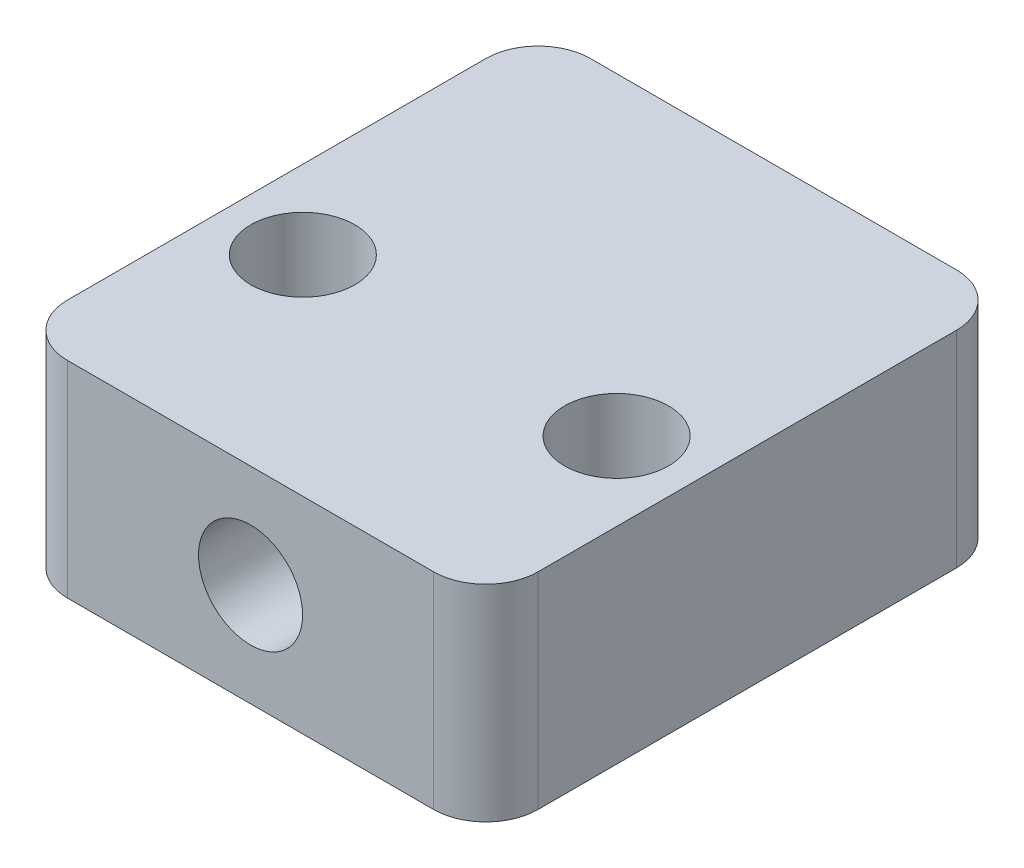
ISO-10303-21;
HEADER;
FILE_DESCRIPTION(('STEP AP214'),'2;1');
FILE_NAME('part.step','',(''),(''),'','','');
FILE_SCHEMA(('AUTOMOTIVE_DESIGN { 1 0 10303 214 1 1 1 1 }'));
ENDSEC;
DATA;
#1=APPLICATION_CONTEXT('core data for automotive mechanical design processes');
#2=APPLICATION_PROTOCOL_DEFINITION('international standard','automotive_design',2000,#1);
#3=PRODUCT_CONTEXT('',#1,'mechanical');
#4=PRODUCT('Part','Part','',(#3));
#5=PRODUCT_RELATED_PRODUCT_CATEGORY('part','',(#4));
#6=PRODUCT_DEFINITION_FORMATION('','',#4);
#7=PRODUCT_DEFINITION_CONTEXT('part definition',#1,'design');
#8=PRODUCT_DEFINITION('design','',#6,#7);
#9=PRODUCT_DEFINITION_SHAPE('','',#8);
#10=(LENGTH_UNIT() NAMED_UNIT(*) SI_UNIT(.MILLI.,.METRE.));
#11=(NAMED_UNIT(*) PLANE_ANGLE_UNIT() SI_UNIT($,.RADIAN.));
#12=(NAMED_UNIT(*) SI_UNIT($,.STERADIAN.) SOLID_ANGLE_UNIT());
#13=UNCERTAINTY_MEASURE_WITH_UNIT(LENGTH_MEASURE(1.E-05),#10,'distance_accuracy_value','');
#14=(GEOMETRIC_REPRESENTATION_CONTEXT(3) GLOBAL_UNCERTAINTY_ASSIGNED_CONTEXT((#13)) GLOBAL_UNIT_ASSIGNED_CONTEXT((#10,
#11,#12)) REPRESENTATION_CONTEXT('',''));
#15=CARTESIAN_POINT('',(0.,0.,0.));
#16=DIRECTION('',(0.,0.,1.));
#17=DIRECTION('',(1.,0.,0.));
#18=AXIS2_PLACEMENT_3D('',#15,#16,#17);
#19=CARTESIAN_POINT('',(0.,10.,0.));
#20=DIRECTION('',(0.,-1.,0.));
#21=DIRECTION('',(0.,0.,-1.));
#22=AXIS2_PLACEMENT_3D('',#19,#20,#21);
#23=PLANE('',#22);
#24=DIRECTION('',(1.,0.,0.));
#25=VECTOR('',#24,1.);
#26=CARTESIAN_POINT('',(-11.43,10.,12.7));
#27=LINE('',#26,#25);
#28=CARTESIAN_POINT('',(-8.88999999999999,10.,12.7));
#29=VERTEX_POINT('',#28);
#30=CARTESIAN_POINT('',(8.89,10.,12.7));
#31=VERTEX_POINT('',#30);
#32=EDGE_CURVE('E143',#29,#31,#27,.T.);
#33=ORIENTED_EDGE('',*,*,#32,.T.);
#34=CARTESIAN_POINT('',(8.89,10.,10.16));
#35=DIRECTION('',(0.,-1.,0.));
#36=DIRECTION('',(0.,0.,-1.));
#37=AXIS2_PLACEMENT_3D('',#34,#35,#36);
#38=CIRCLE('',#37,2.54);
#39=CARTESIAN_POINT('',(11.43,10.,10.16));
#40=VERTEX_POINT('',#39);
#41=EDGE_CURVE('E161',#31,#40,#38,.F.);
#42=ORIENTED_EDGE('',*,*,#41,.T.);
#43=DIRECTION('',(0.,0.,-1.));
#44=VECTOR('',#43,1.);
#45=CARTESIAN_POINT('',(11.43,10.,12.7));
#46=LINE('',#45,#44);
#47=CARTESIAN_POINT('',(11.43,10.,-10.16));
#48=VERTEX_POINT('',#47);
#49=EDGE_CURVE('E125',#40,#48,#46,.T.);
#50=ORIENTED_EDGE('',*,*,#49,.T.);
#51=CARTESIAN_POINT('',(8.89,10.,-10.16));
#52=DIRECTION('',(0.,-1.,0.));
#53=DIRECTION('',(0.,0.,-1.));
#54=AXIS2_PLACEMENT_3D('',#51,#52,#53);
#55=CIRCLE('',#54,2.54);
#56=CARTESIAN_POINT('',(8.89,10.,-12.7));
#57=VERTEX_POINT('',#56);
#58=EDGE_CURVE('E158',#48,#57,#55,.F.);
#59=ORIENTED_EDGE('',*,*,#58,.T.);
#60=DIRECTION('',(-1.,0.,0.));
#61=VECTOR('',#60,1.);
#62=CARTESIAN_POINT('',(-11.43,10.,-12.7));
#63=LINE('',#62,#61);
#64=CARTESIAN_POINT('',(-8.89,10.,-12.7));
#65=VERTEX_POINT('',#64);
#66=EDGE_CURVE('E172',#57,#65,#63,.T.);
#67=ORIENTED_EDGE('',*,*,#66,.T.);
#68=CARTESIAN_POINT('',(-8.89,10.,-10.16));
#69=DIRECTION('',(0.,-1.,0.));
#70=DIRECTION('',(0.,0.,-1.));
#71=AXIS2_PLACEMENT_3D('',#68,#69,#70);
#72=CIRCLE('',#71,2.54);
#73=CARTESIAN_POINT('',(-11.43,10.,-10.16));
#74=VERTEX_POINT('',#73);
#75=EDGE_CURVE('E61',#65,#74,#72,.F.);
#76=ORIENTED_EDGE('',*,*,#75,.T.);
#77=DIRECTION('',(0.,0.,1.));
#78=VECTOR('',#77,1.);
#79=CARTESIAN_POINT('',(-11.43,10.,12.7));
#80=LINE('',#79,#78);
#81=CARTESIAN_POINT('',(-11.43,10.,10.16));
#82=VERTEX_POINT('',#81);
#83=EDGE_CURVE('E180',#74,#82,#80,.T.);
#84=ORIENTED_EDGE('',*,*,#83,.T.);
#85=CARTESIAN_POINT('',(-8.88999999999999,10.,10.16));
#86=DIRECTION('',(0.,-1.,0.));
#87=DIRECTION('',(0.,0.,-1.));
#88=AXIS2_PLACEMENT_3D('',#85,#86,#87);
#89=CIRCLE('',#88,2.54);
#90=EDGE_CURVE('E156',#82,#29,#89,.F.);
#91=ORIENTED_EDGE('',*,*,#90,.T.);
#92=EDGE_LOOP('',(#33,#42,#50,#59,#67,#76,#84,#91));
#93=FACE_BOUND('',#92,.T.);
#94=CARTESIAN_POINT('',(-7.62,10.,2.54));
#95=DIRECTION('',(0.,1.,0.));
#96=DIRECTION('',(0.,0.,1.));
#97=AXIS2_PLACEMENT_3D('',#94,#95,#96);
#98=CIRCLE('',#97,2.5273);
#99=CARTESIAN_POINT('',(-7.62,10.,5.0673));
#100=VERTEX_POINT('',#99);
#101=EDGE_CURVE('E134',#100,#100,#98,.T.);
#102=ORIENTED_EDGE('',*,*,#101,.F.);
#103=EDGE_LOOP('',(#102));
#104=FACE_BOUND('',#103,.T.);
#105=CARTESIAN_POINT('',(7.62,10.,2.54));
#106=DIRECTION('',(0.,1.,0.));
#107=DIRECTION('',(0.,0.,1.));
#108=AXIS2_PLACEMENT_3D('',#105,#106,#107);
#109=CIRCLE('',#108,2.5273);
#110=CARTESIAN_POINT('',(7.62,10.,5.0673));
#111=VERTEX_POINT('',#110);
#112=EDGE_CURVE('E187',#111,#111,#109,.T.);
#113=ORIENTED_EDGE('',*,*,#112,.F.);
#114=EDGE_LOOP('',(#113));
#115=FACE_BOUND('',#114,.T.);
#116=ADVANCED_FACE('F39',(#93,#104,#115),#23,.F.);
#117=CARTESIAN_POINT('',(0.,0.,0.));
#118=DIRECTION('',(0.,-1.,0.));
#119=DIRECTION('',(0.,0.,-1.));
#120=AXIS2_PLACEMENT_3D('',#117,#118,#119);
#121=PLANE('',#120);
#122=CARTESIAN_POINT('',(-7.62,0.,2.54));
#123=DIRECTION('',(0.,1.,0.));
#124=DIRECTION('',(0.,0.,1.));
#125=AXIS2_PLACEMENT_3D('',#122,#123,#124);
#126=CIRCLE('',#125,2.5273);
#127=CARTESIAN_POINT('',(-7.62,0.,5.0673));
#128=VERTEX_POINT('',#127);
#129=EDGE_CURVE('E140',#128,#128,#126,.T.);
#130=ORIENTED_EDGE('',*,*,#129,.T.);
#131=EDGE_LOOP('',(#130));
#132=FACE_BOUND('',#131,.T.);
#133=DIRECTION('',(0.,0.,-1.));
#134=VECTOR('',#133,1.);
#135=CARTESIAN_POINT('',(11.43,0.,12.7));
#136=LINE('',#135,#134);
#137=CARTESIAN_POINT('',(11.43,0.,10.16));
#138=VERTEX_POINT('',#137);
#139=CARTESIAN_POINT('',(11.43,0.,-10.16));
#140=VERTEX_POINT('',#139);
#141=EDGE_CURVE('E122',#138,#140,#136,.T.);
#142=ORIENTED_EDGE('',*,*,#141,.F.);
#143=CARTESIAN_POINT('',(8.89,0.,10.16));
#144=DIRECTION('',(0.,-1.,0.));
#145=DIRECTION('',(0.,0.,-1.));
#146=AXIS2_PLACEMENT_3D('',#143,#144,#145);
#147=CIRCLE('',#146,2.54);
#148=CARTESIAN_POINT('',(8.89,0.,12.7));
#149=VERTEX_POINT('',#148);
#150=EDGE_CURVE('E105',#138,#149,#147,.T.);
#151=ORIENTED_EDGE('',*,*,#150,.T.);
#152=DIRECTION('',(1.,0.,0.));
#153=VECTOR('',#152,1.);
#154=CARTESIAN_POINT('',(-11.43,0.,12.7));
#155=LINE('',#154,#153);
#156=CARTESIAN_POINT('',(-8.88999999999999,0.,12.7));
#157=VERTEX_POINT('',#156);
#158=EDGE_CURVE('E147',#157,#149,#155,.T.);
#159=ORIENTED_EDGE('',*,*,#158,.F.);
#160=CARTESIAN_POINT('',(-8.88999999999999,0.,10.16));
#161=DIRECTION('',(0.,-1.,0.));
#162=DIRECTION('',(0.,0.,-1.));
#163=AXIS2_PLACEMENT_3D('',#160,#161,#162);
#164=CIRCLE('',#163,2.54);
#165=CARTESIAN_POINT('',(-11.43,0.,10.16));
#166=VERTEX_POINT('',#165);
#167=EDGE_CURVE('E126',#157,#166,#164,.T.);
#168=ORIENTED_EDGE('',*,*,#167,.T.);
#169=DIRECTION('',(0.,0.,1.));
#170=VECTOR('',#169,1.);
#171=CARTESIAN_POINT('',(-11.43,0.,12.7));
#172=LINE('',#171,#170);
#173=CARTESIAN_POINT('',(-11.43,0.,-10.16));
#174=VERTEX_POINT('',#173);
#175=EDGE_CURVE('E137',#174,#166,#172,.T.);
#176=ORIENTED_EDGE('',*,*,#175,.F.);
#177=CARTESIAN_POINT('',(-8.89,0.,-10.16));
#178=DIRECTION('',(0.,-1.,0.));
#179=DIRECTION('',(0.,0.,-1.));
#180=AXIS2_PLACEMENT_3D('',#177,#178,#179);
#181=CIRCLE('',#180,2.54);
#182=CARTESIAN_POINT('',(-8.89,0.,-12.7));
#183=VERTEX_POINT('',#182);
#184=EDGE_CURVE('E116',#174,#183,#181,.T.);
#185=ORIENTED_EDGE('',*,*,#184,.T.);
#186=DIRECTION('',(-1.,0.,0.));
#187=VECTOR('',#186,1.);
#188=CARTESIAN_POINT('',(-11.43,0.,-12.7));
#189=LINE('',#188,#187);
#190=CARTESIAN_POINT('',(8.89,0.,-12.7));
#191=VERTEX_POINT('',#190);
#192=EDGE_CURVE('E133',#191,#183,#189,.T.);
#193=ORIENTED_EDGE('',*,*,#192,.F.);
#194=CARTESIAN_POINT('',(8.89,0.,-10.16));
#195=DIRECTION('',(0.,-1.,0.));
#196=DIRECTION('',(0.,0.,-1.));
#197=AXIS2_PLACEMENT_3D('',#194,#195,#196);
#198=CIRCLE('',#197,2.54);
#199=EDGE_CURVE('E132',#191,#140,#198,.T.);
#200=ORIENTED_EDGE('',*,*,#199,.T.);
#201=EDGE_LOOP('',(#142,#151,#159,#168,#176,#185,#193,#200));
#202=FACE_BOUND('',#201,.T.);
#203=CARTESIAN_POINT('',(7.62,0.,2.54));
#204=DIRECTION('',(0.,1.,0.));
#205=DIRECTION('',(0.,0.,1.));
#206=AXIS2_PLACEMENT_3D('',#203,#204,#205);
#207=CIRCLE('',#206,2.5273);
#208=CARTESIAN_POINT('',(7.62,0.,5.0673));
#209=VERTEX_POINT('',#208);
#210=EDGE_CURVE('E189',#209,#209,#207,.T.);
#211=ORIENTED_EDGE('',*,*,#210,.T.);
#212=EDGE_LOOP('',(#211));
#213=FACE_BOUND('',#212,.T.);
#214=ADVANCED_FACE('F129',(#132,#202,#213),#121,.T.);
#215=CARTESIAN_POINT('',(11.43,10.,12.7));
#216=DIRECTION('',(-1.,0.,0.));
#217=DIRECTION('',(0.,0.,1.));
#218=AXIS2_PLACEMENT_3D('',#215,#216,#217);
#219=PLANE('',#218);
#220=ORIENTED_EDGE('',*,*,#49,.F.);
#221=DIRECTION('',(0.,-1.,0.));
#222=VECTOR('',#221,1.);
#223=CARTESIAN_POINT('',(11.43,10.,10.16));
#224=LINE('',#223,#222);
#225=EDGE_CURVE('E109',#40,#138,#224,.T.);
#226=ORIENTED_EDGE('',*,*,#225,.T.);
#227=ORIENTED_EDGE('',*,*,#141,.T.);
#228=DIRECTION('',(0.,-1.,0.));
#229=VECTOR('',#228,1.);
#230=CARTESIAN_POINT('',(11.43,10.,-10.16));
#231=LINE('',#230,#229);
#232=EDGE_CURVE('E127',#140,#48,#231,.F.);
#233=ORIENTED_EDGE('',*,*,#232,.T.);
#234=EDGE_LOOP('',(#220,#226,#227,#233));
#235=FACE_BOUND('',#234,.T.);
#236=ADVANCED_FACE('F121',(#235),#219,.F.);
#237=CARTESIAN_POINT('',(-11.43,10.,-12.7));
#238=DIRECTION('',(0.,0.,1.));
#239=DIRECTION('',(1.,0.,0.));
#240=AXIS2_PLACEMENT_3D('',#237,#238,#239);
#241=PLANE('',#240);
#242=CARTESIAN_POINT('',(0.,5.,-12.7));
#243=DIRECTION('',(0.,0.,1.));
#244=DIRECTION('',(1.,0.,0.));
#245=AXIS2_PLACEMENT_3D('',#242,#243,#244);
#246=CIRCLE('',#245,2.5273);
#247=CARTESIAN_POINT('',(2.5273,5.,-12.7));
#248=VERTEX_POINT('',#247);
#249=EDGE_CURVE('E192',#248,#248,#246,.F.);
#250=ORIENTED_EDGE('',*,*,#249,.F.);
#251=EDGE_LOOP('',(#250));
#252=FACE_BOUND('',#251,.T.);
#253=ORIENTED_EDGE('',*,*,#192,.T.);
#254=DIRECTION('',(0.,-1.,0.));
#255=VECTOR('',#254,1.);
#256=CARTESIAN_POINT('',(-8.89,10.,-12.7));
#257=LINE('',#256,#255);
#258=EDGE_CURVE('E11',#183,#65,#257,.F.);
#259=ORIENTED_EDGE('',*,*,#258,.T.);
#260=ORIENTED_EDGE('',*,*,#66,.F.);
#261=DIRECTION('',(0.,-1.,0.));
#262=VECTOR('',#261,1.);
#263=CARTESIAN_POINT('',(8.89,10.,-12.7));
#264=LINE('',#263,#262);
#265=EDGE_CURVE('E47',#57,#191,#264,.T.);
#266=ORIENTED_EDGE('',*,*,#265,.T.);
#267=EDGE_LOOP('',(#253,#259,#260,#266));
#268=FACE_BOUND('',#267,.T.);
#269=ADVANCED_FACE('F170',(#252,#268),#241,.F.);
#270=CARTESIAN_POINT('',(-11.43,10.,12.7));
#271=DIRECTION('',(1.,0.,0.));
#272=DIRECTION('',(0.,0.,-1.));
#273=AXIS2_PLACEMENT_3D('',#270,#271,#272);
#274=PLANE('',#273);
#275=ORIENTED_EDGE('',*,*,#83,.F.);
#276=DIRECTION('',(0.,-1.,0.));
#277=VECTOR('',#276,1.);
#278=CARTESIAN_POINT('',(-11.43,10.,-10.16));
#279=LINE('',#278,#277);
#280=EDGE_CURVE('E164',#74,#174,#279,.T.);
#281=ORIENTED_EDGE('',*,*,#280,.T.);
#282=ORIENTED_EDGE('',*,*,#175,.T.);
#283=DIRECTION('',(0.,-1.,0.));
#284=VECTOR('',#283,1.);
#285=CARTESIAN_POINT('',(-11.43,10.,10.16));
#286=LINE('',#285,#284);
#287=EDGE_CURVE('E54',#166,#82,#286,.F.);
#288=ORIENTED_EDGE('',*,*,#287,.T.);
#289=EDGE_LOOP('',(#275,#281,#282,#288));
#290=FACE_BOUND('',#289,.T.);
#291=ADVANCED_FACE('F179',(#290),#274,.F.);
#292=CARTESIAN_POINT('',(-11.43,10.,12.7));
#293=DIRECTION('',(0.,0.,-1.));
#294=DIRECTION('',(-1.,0.,0.));
#295=AXIS2_PLACEMENT_3D('',#292,#293,#294);
#296=PLANE('',#295);
#297=CARTESIAN_POINT('',(0.,5.,12.7));
#298=DIRECTION('',(0.,0.,1.));
#299=DIRECTION('',(1.,0.,0.));
#300=AXIS2_PLACEMENT_3D('',#297,#298,#299);
#301=CIRCLE('',#300,2.5273);
#302=CARTESIAN_POINT('',(2.5273,5.,12.7));
#303=VERTEX_POINT('',#302);
#304=EDGE_CURVE('E195',#303,#303,#301,.F.);
#305=ORIENTED_EDGE('',*,*,#304,.T.);
#306=EDGE_LOOP('',(#305));
#307=FACE_BOUND('',#306,.T.);
#308=ORIENTED_EDGE('',*,*,#158,.T.);
#309=DIRECTION('',(0.,-1.,0.));
#310=VECTOR('',#309,1.);
#311=CARTESIAN_POINT('',(8.89,10.,12.7));
#312=LINE('',#311,#310);
#313=EDGE_CURVE('E110',#149,#31,#312,.F.);
#314=ORIENTED_EDGE('',*,*,#313,.T.);
#315=ORIENTED_EDGE('',*,*,#32,.F.);
#316=DIRECTION('',(0.,-1.,0.));
#317=VECTOR('',#316,1.);
#318=CARTESIAN_POINT('',(-8.88999999999999,10.,12.7));
#319=LINE('',#318,#317);
#320=EDGE_CURVE('E115',#29,#157,#319,.T.);
#321=ORIENTED_EDGE('',*,*,#320,.T.);
#322=EDGE_LOOP('',(#308,#314,#315,#321));
#323=FACE_BOUND('',#322,.T.);
#324=ADVANCED_FACE('F211',(#307,#323),#296,.F.);
#325=CARTESIAN_POINT('',(-7.62,10.,2.54));
#326=DIRECTION('',(0.,-1.,0.));
#327=DIRECTION('',(0.,0.,-1.));
#328=AXIS2_PLACEMENT_3D('',#325,#326,#327);
#329=CYLINDRICAL_SURFACE('',#328,2.5273);
#330=ORIENTED_EDGE('',*,*,#101,.T.);
#331=EDGE_LOOP('',(#330));
#332=FACE_BOUND('',#331,.T.);
#333=ORIENTED_EDGE('',*,*,#129,.F.);
#334=EDGE_LOOP('',(#333));
#335=FACE_BOUND('',#334,.T.);
#336=ADVANCED_FACE('F225',(#332,#335),#329,.F.);
#337=CARTESIAN_POINT('',(7.62,10.,2.54));
#338=DIRECTION('',(0.,-1.,0.));
#339=DIRECTION('',(0.,0.,-1.));
#340=AXIS2_PLACEMENT_3D('',#337,#338,#339);
#341=CYLINDRICAL_SURFACE('',#340,2.5273);
#342=ORIENTED_EDGE('',*,*,#112,.T.);
#343=EDGE_LOOP('',(#342));
#344=FACE_BOUND('',#343,.T.);
#345=ORIENTED_EDGE('',*,*,#210,.F.);
#346=EDGE_LOOP('',(#345));
#347=FACE_BOUND('',#346,.T.);
#348=ADVANCED_FACE('F233',(#344,#347),#341,.F.);
#349=CARTESIAN_POINT('',(8.89,10.,10.16));
#350=DIRECTION('',(0.,-1.,0.));
#351=DIRECTION('',(0.,0.,-1.));
#352=AXIS2_PLACEMENT_3D('',#349,#350,#351);
#353=CYLINDRICAL_SURFACE('',#352,2.54);
#354=ORIENTED_EDGE('',*,*,#41,.F.);
#355=ORIENTED_EDGE('',*,*,#313,.F.);
#356=ORIENTED_EDGE('',*,*,#150,.F.);
#357=ORIENTED_EDGE('',*,*,#225,.F.);
#358=EDGE_LOOP('',(#354,#355,#356,#357));
#359=FACE_BOUND('',#358,.T.);
#360=ADVANCED_FACE('F108',(#359),#353,.T.);
#361=CARTESIAN_POINT('',(-8.89,10.,-10.16));
#362=DIRECTION('',(0.,-1.,0.));
#363=DIRECTION('',(0.,0.,-1.));
#364=AXIS2_PLACEMENT_3D('',#361,#362,#363);
#365=CYLINDRICAL_SURFACE('',#364,2.54);
#366=ORIENTED_EDGE('',*,*,#75,.F.);
#367=ORIENTED_EDGE('',*,*,#258,.F.);
#368=ORIENTED_EDGE('',*,*,#184,.F.);
#369=ORIENTED_EDGE('',*,*,#280,.F.);
#370=EDGE_LOOP('',(#366,#367,#368,#369));
#371=FACE_BOUND('',#370,.T.);
#372=ADVANCED_FACE('F178',(#371),#365,.T.);
#373=CARTESIAN_POINT('',(8.89,10.,-10.16));
#374=DIRECTION('',(0.,-1.,0.));
#375=DIRECTION('',(0.,0.,-1.));
#376=AXIS2_PLACEMENT_3D('',#373,#374,#375);
#377=CYLINDRICAL_SURFACE('',#376,2.54);
#378=ORIENTED_EDGE('',*,*,#58,.F.);
#379=ORIENTED_EDGE('',*,*,#232,.F.);
#380=ORIENTED_EDGE('',*,*,#199,.F.);
#381=ORIENTED_EDGE('',*,*,#265,.F.);
#382=EDGE_LOOP('',(#378,#379,#380,#381));
#383=FACE_BOUND('',#382,.T.);
#384=ADVANCED_FACE('F240',(#383),#377,.T.);
#385=CARTESIAN_POINT('',(-8.88999999999999,10.,10.16));
#386=DIRECTION('',(0.,-1.,0.));
#387=DIRECTION('',(0.,0.,-1.));
#388=AXIS2_PLACEMENT_3D('',#385,#386,#387);
#389=CYLINDRICAL_SURFACE('',#388,2.54);
#390=ORIENTED_EDGE('',*,*,#90,.F.);
#391=ORIENTED_EDGE('',*,*,#287,.F.);
#392=ORIENTED_EDGE('',*,*,#167,.F.);
#393=ORIENTED_EDGE('',*,*,#320,.F.);
#394=EDGE_LOOP('',(#390,#391,#392,#393));
#395=FACE_BOUND('',#394,.T.);
#396=ADVANCED_FACE('F41',(#395),#389,.T.);
#397=CARTESIAN_POINT('',(0.,5.,-12.7));
#398=DIRECTION('',(0.,0.,1.));
#399=DIRECTION('',(1.,0.,0.));
#400=AXIS2_PLACEMENT_3D('',#397,#398,#399);
#401=CYLINDRICAL_SURFACE('',#400,2.5273);
#402=ORIENTED_EDGE('',*,*,#249,.T.);
#403=EDGE_LOOP('',(#402));
#404=FACE_BOUND('',#403,.T.);
#405=ORIENTED_EDGE('',*,*,#304,.F.);
#406=EDGE_LOOP('',(#405));
#407=FACE_BOUND('',#406,.T.);
#408=ADVANCED_FACE('F201',(#404,#407),#401,.F.);
#409=CLOSED_SHELL('',(#116,#214,#236,#269,#291,#324,#336,#348,#360,#372,#384,#396,#408));
#410=MANIFOLD_SOLID_BREP('B2',#409);
#411=ADVANCED_BREP_SHAPE_REPRESENTATION('',(#18,#410),#14);
#412=SHAPE_DEFINITION_REPRESENTATION(#9,#411);
ENDSEC;
END-ISO-10303-21;
